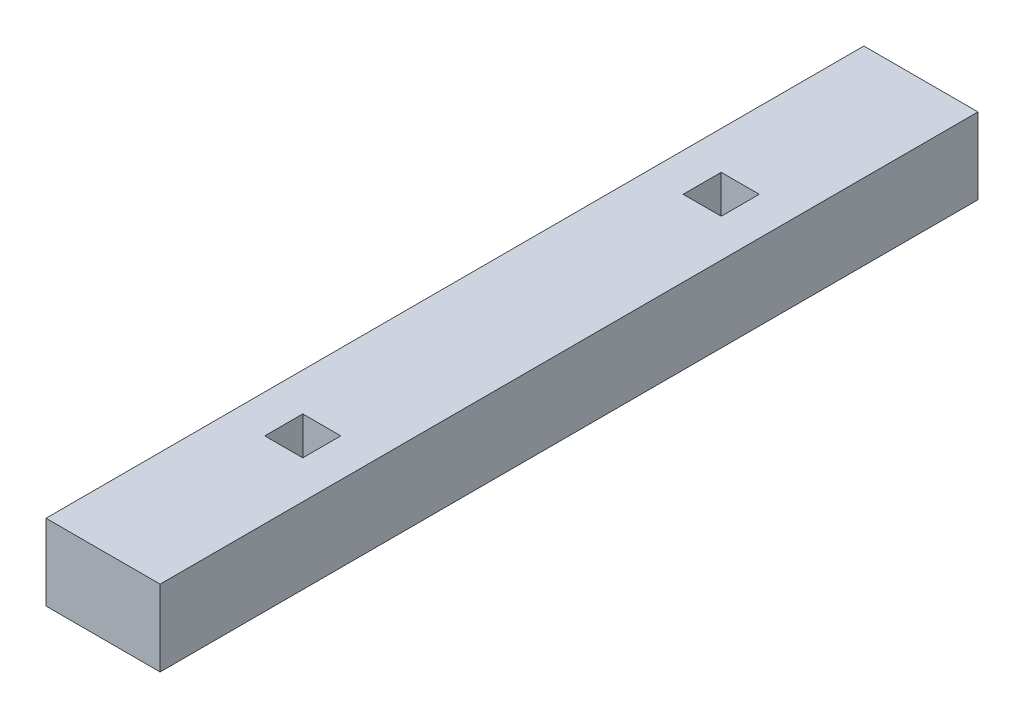
ISO-10303-21;
HEADER;
FILE_DESCRIPTION(('STEP AP214'),'2;1');
FILE_NAME('part.step','',(''),(''),'','','');
FILE_SCHEMA(('AUTOMOTIVE_DESIGN { 1 0 10303 214 1 1 1 1 }'));
ENDSEC;
DATA;
#1=APPLICATION_CONTEXT('core data for automotive mechanical design processes');
#2=APPLICATION_PROTOCOL_DEFINITION('international standard','automotive_design',2000,#1);
#3=PRODUCT_CONTEXT('',#1,'mechanical');
#4=PRODUCT('Part','Part','',(#3));
#5=PRODUCT_RELATED_PRODUCT_CATEGORY('part','',(#4));
#6=PRODUCT_DEFINITION_FORMATION('','',#4);
#7=PRODUCT_DEFINITION_CONTEXT('part definition',#1,'design');
#8=PRODUCT_DEFINITION('design','',#6,#7);
#9=PRODUCT_DEFINITION_SHAPE('','',#8);
#10=(LENGTH_UNIT() NAMED_UNIT(*) SI_UNIT(.MILLI.,.METRE.));
#11=(NAMED_UNIT(*) PLANE_ANGLE_UNIT() SI_UNIT($,.RADIAN.));
#12=(NAMED_UNIT(*) SI_UNIT($,.STERADIAN.) SOLID_ANGLE_UNIT());
#13=UNCERTAINTY_MEASURE_WITH_UNIT(LENGTH_MEASURE(1.E-05),#10,'distance_accuracy_value','');
#14=(GEOMETRIC_REPRESENTATION_CONTEXT(3) GLOBAL_UNCERTAINTY_ASSIGNED_CONTEXT((#13)) GLOBAL_UNIT_ASSIGNED_CONTEXT((#10,
#11,#12)) REPRESENTATION_CONTEXT('',''));
#15=CARTESIAN_POINT('',(0.,0.,0.));
#16=DIRECTION('',(0.,0.,1.));
#17=DIRECTION('',(1.,0.,0.));
#18=AXIS2_PLACEMENT_3D('',#15,#16,#17);
#19=CARTESIAN_POINT('',(0.,20.,0.));
#20=DIRECTION('',(0.,1.,0.));
#21=DIRECTION('',(0.,0.,1.));
#22=AXIS2_PLACEMENT_3D('',#19,#20,#21);
#23=PLANE('',#22);
#24=DIRECTION('',(0.,0.,1.));
#25=VECTOR('',#24,1.);
#26=CARTESIAN_POINT('',(-15.,20.,-102.5));
#27=LINE('',#26,#25);
#28=CARTESIAN_POINT('',(-15.,20.,-102.5));
#29=VERTEX_POINT('',#28);
#30=CARTESIAN_POINT('',(-15.,20.,112.5));
#31=VERTEX_POINT('',#30);
#32=EDGE_CURVE('E189',#29,#31,#27,.T.);
#33=ORIENTED_EDGE('',*,*,#32,.T.);
#34=DIRECTION('',(1.,0.,0.));
#35=VECTOR('',#34,1.);
#36=CARTESIAN_POINT('',(-15.,20.,112.5));
#37=LINE('',#36,#35);
#38=CARTESIAN_POINT('',(15.,20.,112.5));
#39=VERTEX_POINT('',#38);
#40=EDGE_CURVE('E192',#31,#39,#37,.T.);
#41=ORIENTED_EDGE('',*,*,#40,.T.);
#42=DIRECTION('',(0.,0.,-1.));
#43=VECTOR('',#42,1.);
#44=CARTESIAN_POINT('',(15.,20.,-102.5));
#45=LINE('',#44,#43);
#46=CARTESIAN_POINT('',(15.,20.,-102.5));
#47=VERTEX_POINT('',#46);
#48=EDGE_CURVE('E195',#39,#47,#45,.T.);
#49=ORIENTED_EDGE('',*,*,#48,.T.);
#50=DIRECTION('',(-1.,0.,0.));
#51=VECTOR('',#50,1.);
#52=CARTESIAN_POINT('',(-15.,20.,-102.5));
#53=LINE('',#52,#51);
#54=EDGE_CURVE('E197',#47,#29,#53,.T.);
#55=ORIENTED_EDGE('',*,*,#54,.T.);
#56=EDGE_LOOP('',(#33,#41,#49,#55));
#57=FACE_BOUND('',#56,.T.);
#58=DIRECTION('',(1.,0.,0.));
#59=VECTOR('',#58,1.);
#60=CARTESIAN_POINT('',(-5.,20.,-45.));
#61=LINE('',#60,#59);
#62=CARTESIAN_POINT('',(-5.,20.,-45.));
#63=VERTEX_POINT('',#62);
#64=CARTESIAN_POINT('',(5.,20.,-45.));
#65=VERTEX_POINT('',#64);
#66=EDGE_CURVE('E160',#63,#65,#61,.T.);
#67=ORIENTED_EDGE('',*,*,#66,.F.);
#68=DIRECTION('',(0.,0.,1.));
#69=VECTOR('',#68,1.);
#70=CARTESIAN_POINT('',(-5.,20.,-55.));
#71=LINE('',#70,#69);
#72=CARTESIAN_POINT('',(-5.,20.,-55.));
#73=VERTEX_POINT('',#72);
#74=EDGE_CURVE('E158',#73,#63,#71,.T.);
#75=ORIENTED_EDGE('',*,*,#74,.F.);
#76=DIRECTION('',(-1.,0.,0.));
#77=VECTOR('',#76,1.);
#78=CARTESIAN_POINT('',(-5.,20.,-55.));
#79=LINE('',#78,#77);
#80=CARTESIAN_POINT('',(5.,20.,-55.));
#81=VERTEX_POINT('',#80);
#82=EDGE_CURVE('E166',#81,#73,#79,.T.);
#83=ORIENTED_EDGE('',*,*,#82,.F.);
#84=DIRECTION('',(0.,0.,-1.));
#85=VECTOR('',#84,1.);
#86=CARTESIAN_POINT('',(5.,20.,-55.));
#87=LINE('',#86,#85);
#88=EDGE_CURVE('E163',#65,#81,#87,.T.);
#89=ORIENTED_EDGE('',*,*,#88,.F.);
#90=EDGE_LOOP('',(#67,#75,#83,#89));
#91=FACE_BOUND('',#90,.T.);
#92=DIRECTION('',(0.,0.,-1.));
#93=VECTOR('',#92,1.);
#94=CARTESIAN_POINT('',(5.,20.,65.));
#95=LINE('',#94,#93);
#96=CARTESIAN_POINT('',(5.,20.,65.));
#97=VERTEX_POINT('',#96);
#98=CARTESIAN_POINT('',(5.,20.,55.));
#99=VERTEX_POINT('',#98);
#100=EDGE_CURVE('E130',#97,#99,#95,.T.);
#101=ORIENTED_EDGE('',*,*,#100,.F.);
#102=DIRECTION('',(1.,0.,0.));
#103=VECTOR('',#102,1.);
#104=CARTESIAN_POINT('',(-5.,20.,65.));
#105=LINE('',#104,#103);
#106=CARTESIAN_POINT('',(-5.,20.,65.));
#107=VERTEX_POINT('',#106);
#108=EDGE_CURVE('E122',#107,#97,#105,.T.);
#109=ORIENTED_EDGE('',*,*,#108,.F.);
#110=DIRECTION('',(0.,0.,1.));
#111=VECTOR('',#110,1.);
#112=CARTESIAN_POINT('',(-5.,20.,65.));
#113=LINE('',#112,#111);
#114=CARTESIAN_POINT('',(-5.,20.,55.));
#115=VERTEX_POINT('',#114);
#116=EDGE_CURVE('E144',#115,#107,#113,.T.);
#117=ORIENTED_EDGE('',*,*,#116,.F.);
#118=DIRECTION('',(-1.,0.,0.));
#119=VECTOR('',#118,1.);
#120=CARTESIAN_POINT('',(-5.,20.,55.));
#121=LINE('',#120,#119);
#122=EDGE_CURVE('E142',#99,#115,#121,.T.);
#123=ORIENTED_EDGE('',*,*,#122,.F.);
#124=EDGE_LOOP('',(#101,#109,#117,#123));
#125=FACE_BOUND('',#124,.T.);
#126=ADVANCED_FACE('F33',(#57,#91,#125),#23,.T.);
#127=CARTESIAN_POINT('',(0.,0.,0.));
#128=DIRECTION('',(0.,1.,0.));
#129=DIRECTION('',(0.,0.,1.));
#130=AXIS2_PLACEMENT_3D('',#127,#128,#129);
#131=PLANE('',#130);
#132=DIRECTION('',(0.,0.,1.));
#133=VECTOR('',#132,1.);
#134=CARTESIAN_POINT('',(-5.,0.,-55.));
#135=LINE('',#134,#133);
#136=CARTESIAN_POINT('',(-5.,0.,-55.));
#137=VERTEX_POINT('',#136);
#138=CARTESIAN_POINT('',(-5.,0.,-45.));
#139=VERTEX_POINT('',#138);
#140=EDGE_CURVE('E138',#137,#139,#135,.T.);
#141=ORIENTED_EDGE('',*,*,#140,.T.);
#142=DIRECTION('',(1.,0.,0.));
#143=VECTOR('',#142,1.);
#144=CARTESIAN_POINT('',(-5.,0.,-45.));
#145=LINE('',#144,#143);
#146=CARTESIAN_POINT('',(5.,0.,-45.));
#147=VERTEX_POINT('',#146);
#148=EDGE_CURVE('E171',#139,#147,#145,.T.);
#149=ORIENTED_EDGE('',*,*,#148,.T.);
#150=DIRECTION('',(0.,0.,-1.));
#151=VECTOR('',#150,1.);
#152=CARTESIAN_POINT('',(5.,0.,-55.));
#153=LINE('',#152,#151);
#154=CARTESIAN_POINT('',(5.,0.,-55.));
#155=VERTEX_POINT('',#154);
#156=EDGE_CURVE('E174',#147,#155,#153,.T.);
#157=ORIENTED_EDGE('',*,*,#156,.T.);
#158=DIRECTION('',(-1.,0.,0.));
#159=VECTOR('',#158,1.);
#160=CARTESIAN_POINT('',(-5.,0.,-55.));
#161=LINE('',#160,#159);
#162=EDGE_CURVE('E161',#155,#137,#161,.T.);
#163=ORIENTED_EDGE('',*,*,#162,.T.);
#164=EDGE_LOOP('',(#141,#149,#157,#163));
#165=FACE_BOUND('',#164,.T.);
#166=DIRECTION('',(0.,0.,1.));
#167=VECTOR('',#166,1.);
#168=CARTESIAN_POINT('',(-15.,0.,-102.5));
#169=LINE('',#168,#167);
#170=CARTESIAN_POINT('',(-15.,0.,-102.5));
#171=VERTEX_POINT('',#170);
#172=CARTESIAN_POINT('',(-15.,0.,112.5));
#173=VERTEX_POINT('',#172);
#174=EDGE_CURVE('E188',#171,#173,#169,.T.);
#175=ORIENTED_EDGE('',*,*,#174,.F.);
#176=DIRECTION('',(-1.,0.,0.));
#177=VECTOR('',#176,1.);
#178=CARTESIAN_POINT('',(-15.,0.,-102.5));
#179=LINE('',#178,#177);
#180=CARTESIAN_POINT('',(15.,0.,-102.5));
#181=VERTEX_POINT('',#180);
#182=EDGE_CURVE('E193',#181,#171,#179,.T.);
#183=ORIENTED_EDGE('',*,*,#182,.F.);
#184=DIRECTION('',(0.,0.,-1.));
#185=VECTOR('',#184,1.);
#186=CARTESIAN_POINT('',(15.,0.,-102.5));
#187=LINE('',#186,#185);
#188=CARTESIAN_POINT('',(15.,0.,112.5));
#189=VERTEX_POINT('',#188);
#190=EDGE_CURVE('E204',#189,#181,#187,.T.);
#191=ORIENTED_EDGE('',*,*,#190,.F.);
#192=DIRECTION('',(1.,0.,0.));
#193=VECTOR('',#192,1.);
#194=CARTESIAN_POINT('',(-15.,0.,112.5));
#195=LINE('',#194,#193);
#196=EDGE_CURVE('E202',#173,#189,#195,.T.);
#197=ORIENTED_EDGE('',*,*,#196,.F.);
#198=EDGE_LOOP('',(#175,#183,#191,#197));
#199=FACE_BOUND('',#198,.T.);
#200=DIRECTION('',(1.,0.,0.));
#201=VECTOR('',#200,1.);
#202=CARTESIAN_POINT('',(-5.,0.,65.));
#203=LINE('',#202,#201);
#204=CARTESIAN_POINT('',(-5.,0.,65.));
#205=VERTEX_POINT('',#204);
#206=CARTESIAN_POINT('',(5.,0.,65.));
#207=VERTEX_POINT('',#206);
#208=EDGE_CURVE('E56',#205,#207,#203,.T.);
#209=ORIENTED_EDGE('',*,*,#208,.T.);
#210=DIRECTION('',(0.,0.,-1.));
#211=VECTOR('',#210,1.);
#212=CARTESIAN_POINT('',(5.,0.,65.));
#213=LINE('',#212,#211);
#214=CARTESIAN_POINT('',(5.,0.,55.));
#215=VERTEX_POINT('',#214);
#216=EDGE_CURVE('E137',#207,#215,#213,.T.);
#217=ORIENTED_EDGE('',*,*,#216,.T.);
#218=DIRECTION('',(-1.,0.,0.));
#219=VECTOR('',#218,1.);
#220=CARTESIAN_POINT('',(-5.,0.,55.));
#221=LINE('',#220,#219);
#222=CARTESIAN_POINT('',(-5.,0.,55.));
#223=VERTEX_POINT('',#222);
#224=EDGE_CURVE('E150',#215,#223,#221,.T.);
#225=ORIENTED_EDGE('',*,*,#224,.T.);
#226=DIRECTION('',(0.,0.,1.));
#227=VECTOR('',#226,1.);
#228=CARTESIAN_POINT('',(-5.,0.,65.));
#229=LINE('',#228,#227);
#230=EDGE_CURVE('E131',#223,#205,#229,.T.);
#231=ORIENTED_EDGE('',*,*,#230,.T.);
#232=EDGE_LOOP('',(#209,#217,#225,#231));
#233=FACE_BOUND('',#232,.T.);
#234=ADVANCED_FACE('F222',(#165,#199,#233),#131,.F.);
#235=CARTESIAN_POINT('',(-15.,20.,-102.5));
#236=DIRECTION('',(1.,0.,0.));
#237=DIRECTION('',(0.,0.,-1.));
#238=AXIS2_PLACEMENT_3D('',#235,#236,#237);
#239=PLANE('',#238);
#240=ORIENTED_EDGE('',*,*,#174,.T.);
#241=DIRECTION('',(0.,-1.,0.));
#242=VECTOR('',#241,1.);
#243=CARTESIAN_POINT('',(-15.,20.,112.5));
#244=LINE('',#243,#242);
#245=EDGE_CURVE('E11',#31,#173,#244,.T.);
#246=ORIENTED_EDGE('',*,*,#245,.F.);
#247=ORIENTED_EDGE('',*,*,#32,.F.);
#248=DIRECTION('',(0.,-1.,0.));
#249=VECTOR('',#248,1.);
#250=CARTESIAN_POINT('',(-15.,20.,-102.5));
#251=LINE('',#250,#249);
#252=EDGE_CURVE('E199',#29,#171,#251,.T.);
#253=ORIENTED_EDGE('',*,*,#252,.T.);
#254=EDGE_LOOP('',(#240,#246,#247,#253));
#255=FACE_BOUND('',#254,.T.);
#256=ADVANCED_FACE('F35',(#255),#239,.F.);
#257=CARTESIAN_POINT('',(-15.,20.,112.5));
#258=DIRECTION('',(0.,0.,-1.));
#259=DIRECTION('',(-1.,0.,0.));
#260=AXIS2_PLACEMENT_3D('',#257,#258,#259);
#261=PLANE('',#260);
#262=ORIENTED_EDGE('',*,*,#196,.T.);
#263=DIRECTION('',(0.,-1.,0.));
#264=VECTOR('',#263,1.);
#265=CARTESIAN_POINT('',(15.,20.,112.5));
#266=LINE('',#265,#264);
#267=EDGE_CURVE('E41',#39,#189,#266,.T.);
#268=ORIENTED_EDGE('',*,*,#267,.F.);
#269=ORIENTED_EDGE('',*,*,#40,.F.);
#270=ORIENTED_EDGE('',*,*,#245,.T.);
#271=EDGE_LOOP('',(#262,#268,#269,#270));
#272=FACE_BOUND('',#271,.T.);
#273=ADVANCED_FACE('F233',(#272),#261,.F.);
#274=CARTESIAN_POINT('',(15.,20.,-102.5));
#275=DIRECTION('',(-1.,0.,0.));
#276=DIRECTION('',(0.,0.,1.));
#277=AXIS2_PLACEMENT_3D('',#274,#275,#276);
#278=PLANE('',#277);
#279=ORIENTED_EDGE('',*,*,#190,.T.);
#280=DIRECTION('',(0.,-1.,0.));
#281=VECTOR('',#280,1.);
#282=CARTESIAN_POINT('',(15.,20.,-102.5));
#283=LINE('',#282,#281);
#284=EDGE_CURVE('E209',#47,#181,#283,.T.);
#285=ORIENTED_EDGE('',*,*,#284,.F.);
#286=ORIENTED_EDGE('',*,*,#48,.F.);
#287=ORIENTED_EDGE('',*,*,#267,.T.);
#288=EDGE_LOOP('',(#279,#285,#286,#287));
#289=FACE_BOUND('',#288,.T.);
#290=ADVANCED_FACE('F216',(#289),#278,.F.);
#291=CARTESIAN_POINT('',(-15.,20.,-102.5));
#292=DIRECTION('',(0.,0.,1.));
#293=DIRECTION('',(1.,0.,0.));
#294=AXIS2_PLACEMENT_3D('',#291,#292,#293);
#295=PLANE('',#294);
#296=ORIENTED_EDGE('',*,*,#182,.T.);
#297=ORIENTED_EDGE('',*,*,#252,.F.);
#298=ORIENTED_EDGE('',*,*,#54,.F.);
#299=ORIENTED_EDGE('',*,*,#284,.T.);
#300=EDGE_LOOP('',(#296,#297,#298,#299));
#301=FACE_BOUND('',#300,.T.);
#302=ADVANCED_FACE('F226',(#301),#295,.F.);
#303=CARTESIAN_POINT('',(-5.,20.,-55.));
#304=DIRECTION('',(1.,0.,0.));
#305=DIRECTION('',(0.,0.,-1.));
#306=AXIS2_PLACEMENT_3D('',#303,#304,#305);
#307=PLANE('',#306);
#308=ORIENTED_EDGE('',*,*,#140,.F.);
#309=DIRECTION('',(0.,-1.,0.));
#310=VECTOR('',#309,1.);
#311=CARTESIAN_POINT('',(-5.,20.,-55.));
#312=LINE('',#311,#310);
#313=EDGE_CURVE('E168',#73,#137,#312,.T.);
#314=ORIENTED_EDGE('',*,*,#313,.F.);
#315=ORIENTED_EDGE('',*,*,#74,.T.);
#316=DIRECTION('',(0.,-1.,0.));
#317=VECTOR('',#316,1.);
#318=CARTESIAN_POINT('',(-5.,20.,-45.));
#319=LINE('',#318,#317);
#320=EDGE_CURVE('E185',#63,#139,#319,.T.);
#321=ORIENTED_EDGE('',*,*,#320,.T.);
#322=EDGE_LOOP('',(#308,#314,#315,#321));
#323=FACE_BOUND('',#322,.T.);
#324=ADVANCED_FACE('F248',(#323),#307,.T.);
#325=CARTESIAN_POINT('',(-5.,20.,-45.));
#326=DIRECTION('',(0.,0.,-1.));
#327=DIRECTION('',(-1.,0.,0.));
#328=AXIS2_PLACEMENT_3D('',#325,#326,#327);
#329=PLANE('',#328);
#330=ORIENTED_EDGE('',*,*,#148,.F.);
#331=ORIENTED_EDGE('',*,*,#320,.F.);
#332=ORIENTED_EDGE('',*,*,#66,.T.);
#333=DIRECTION('',(0.,-1.,0.));
#334=VECTOR('',#333,1.);
#335=CARTESIAN_POINT('',(5.,20.,-45.));
#336=LINE('',#335,#334);
#337=EDGE_CURVE('E183',#65,#147,#336,.T.);
#338=ORIENTED_EDGE('',*,*,#337,.T.);
#339=EDGE_LOOP('',(#330,#331,#332,#338));
#340=FACE_BOUND('',#339,.T.);
#341=ADVANCED_FACE('F255',(#340),#329,.T.);
#342=CARTESIAN_POINT('',(5.,20.,-55.));
#343=DIRECTION('',(-1.,0.,0.));
#344=DIRECTION('',(0.,0.,1.));
#345=AXIS2_PLACEMENT_3D('',#342,#343,#344);
#346=PLANE('',#345);
#347=ORIENTED_EDGE('',*,*,#156,.F.);
#348=ORIENTED_EDGE('',*,*,#337,.F.);
#349=ORIENTED_EDGE('',*,*,#88,.T.);
#350=DIRECTION('',(0.,-1.,0.));
#351=VECTOR('',#350,1.);
#352=CARTESIAN_POINT('',(5.,20.,-55.));
#353=LINE('',#352,#351);
#354=EDGE_CURVE('E181',#81,#155,#353,.T.);
#355=ORIENTED_EDGE('',*,*,#354,.T.);
#356=EDGE_LOOP('',(#347,#348,#349,#355));
#357=FACE_BOUND('',#356,.T.);
#358=ADVANCED_FACE('F260',(#357),#346,.T.);
#359=CARTESIAN_POINT('',(-5.,20.,-55.));
#360=DIRECTION('',(0.,0.,1.));
#361=DIRECTION('',(1.,0.,0.));
#362=AXIS2_PLACEMENT_3D('',#359,#360,#361);
#363=PLANE('',#362);
#364=ORIENTED_EDGE('',*,*,#162,.F.);
#365=ORIENTED_EDGE('',*,*,#354,.F.);
#366=ORIENTED_EDGE('',*,*,#82,.T.);
#367=ORIENTED_EDGE('',*,*,#313,.T.);
#368=EDGE_LOOP('',(#364,#365,#366,#367));
#369=FACE_BOUND('',#368,.T.);
#370=ADVANCED_FACE('F267',(#369),#363,.T.);
#371=CARTESIAN_POINT('',(-5.,20.,65.));
#372=DIRECTION('',(0.,0.,-1.));
#373=DIRECTION('',(-1.,0.,0.));
#374=AXIS2_PLACEMENT_3D('',#371,#372,#373);
#375=PLANE('',#374);
#376=ORIENTED_EDGE('',*,*,#208,.F.);
#377=DIRECTION('',(0.,-1.,0.));
#378=VECTOR('',#377,1.);
#379=CARTESIAN_POINT('',(-5.,20.,65.));
#380=LINE('',#379,#378);
#381=EDGE_CURVE('E126',#107,#205,#380,.T.);
#382=ORIENTED_EDGE('',*,*,#381,.F.);
#383=ORIENTED_EDGE('',*,*,#108,.T.);
#384=DIRECTION('',(0.,-1.,0.));
#385=VECTOR('',#384,1.);
#386=CARTESIAN_POINT('',(5.,20.,65.));
#387=LINE('',#386,#385);
#388=EDGE_CURVE('E125',#97,#207,#387,.T.);
#389=ORIENTED_EDGE('',*,*,#388,.T.);
#390=EDGE_LOOP('',(#376,#382,#383,#389));
#391=FACE_BOUND('',#390,.T.);
#392=ADVANCED_FACE('F124',(#391),#375,.T.);
#393=CARTESIAN_POINT('',(5.,20.,65.));
#394=DIRECTION('',(-1.,0.,0.));
#395=DIRECTION('',(0.,0.,1.));
#396=AXIS2_PLACEMENT_3D('',#393,#394,#395);
#397=PLANE('',#396);
#398=ORIENTED_EDGE('',*,*,#216,.F.);
#399=ORIENTED_EDGE('',*,*,#388,.F.);
#400=ORIENTED_EDGE('',*,*,#100,.T.);
#401=DIRECTION('',(0.,-1.,0.));
#402=VECTOR('',#401,1.);
#403=CARTESIAN_POINT('',(5.,20.,55.));
#404=LINE('',#403,#402);
#405=EDGE_CURVE('E139',#99,#215,#404,.T.);
#406=ORIENTED_EDGE('',*,*,#405,.T.);
#407=EDGE_LOOP('',(#398,#399,#400,#406));
#408=FACE_BOUND('',#407,.T.);
#409=ADVANCED_FACE('F134',(#408),#397,.T.);
#410=CARTESIAN_POINT('',(-5.,20.,55.));
#411=DIRECTION('',(0.,0.,1.));
#412=DIRECTION('',(1.,0.,0.));
#413=AXIS2_PLACEMENT_3D('',#410,#411,#412);
#414=PLANE('',#413);
#415=ORIENTED_EDGE('',*,*,#224,.F.);
#416=ORIENTED_EDGE('',*,*,#405,.F.);
#417=ORIENTED_EDGE('',*,*,#122,.T.);
#418=DIRECTION('',(0.,-1.,0.));
#419=VECTOR('',#418,1.);
#420=CARTESIAN_POINT('',(-5.,20.,55.));
#421=LINE('',#420,#419);
#422=EDGE_CURVE('E48',#115,#223,#421,.T.);
#423=ORIENTED_EDGE('',*,*,#422,.T.);
#424=EDGE_LOOP('',(#415,#416,#417,#423));
#425=FACE_BOUND('',#424,.T.);
#426=ADVANCED_FACE('F285',(#425),#414,.T.);
#427=CARTESIAN_POINT('',(-5.,20.,65.));
#428=DIRECTION('',(1.,0.,0.));
#429=DIRECTION('',(0.,0.,-1.));
#430=AXIS2_PLACEMENT_3D('',#427,#428,#429);
#431=PLANE('',#430);
#432=ORIENTED_EDGE('',*,*,#230,.F.);
#433=ORIENTED_EDGE('',*,*,#422,.F.);
#434=ORIENTED_EDGE('',*,*,#116,.T.);
#435=ORIENTED_EDGE('',*,*,#381,.T.);
#436=EDGE_LOOP('',(#432,#433,#434,#435));
#437=FACE_BOUND('',#436,.T.);
#438=ADVANCED_FACE('F288',(#437),#431,.T.);
#439=CLOSED_SHELL('',(#126,#234,#256,#273,#290,#302,#324,#341,#358,#370,#392,#409,#426,#438));
#440=MANIFOLD_SOLID_BREP('B2',#439);
#441=ADVANCED_BREP_SHAPE_REPRESENTATION('',(#18,#440),#14);
#442=SHAPE_DEFINITION_REPRESENTATION(#9,#441);
ENDSEC;
END-ISO-10303-21;
